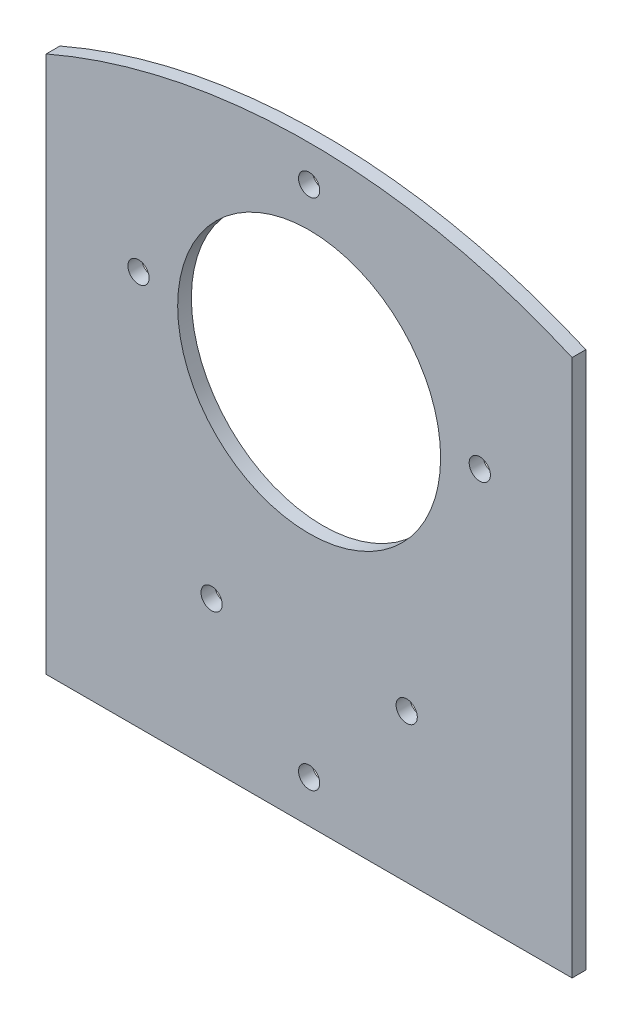
ISO-10303-21;
HEADER;
FILE_DESCRIPTION(('STEP AP214'),'2;1');
FILE_NAME('part.step','',(''),(''),'','','');
FILE_SCHEMA(('AUTOMOTIVE_DESIGN { 1 0 10303 214 1 1 1 1 }'));
ENDSEC;
DATA;
#1=APPLICATION_CONTEXT('core data for automotive mechanical design processes');
#2=APPLICATION_PROTOCOL_DEFINITION('international standard','automotive_design',2000,#1);
#3=PRODUCT_CONTEXT('',#1,'mechanical');
#4=PRODUCT('Part','Part','',(#3));
#5=PRODUCT_RELATED_PRODUCT_CATEGORY('part','',(#4));
#6=PRODUCT_DEFINITION_FORMATION('','',#4);
#7=PRODUCT_DEFINITION_CONTEXT('part definition',#1,'design');
#8=PRODUCT_DEFINITION('design','',#6,#7);
#9=PRODUCT_DEFINITION_SHAPE('','',#8);
#10=(LENGTH_UNIT() NAMED_UNIT(*) SI_UNIT(.MILLI.,.METRE.));
#11=(NAMED_UNIT(*) PLANE_ANGLE_UNIT() SI_UNIT($,.RADIAN.));
#12=(NAMED_UNIT(*) SI_UNIT($,.STERADIAN.) SOLID_ANGLE_UNIT());
#13=UNCERTAINTY_MEASURE_WITH_UNIT(LENGTH_MEASURE(1.E-05),#10,'distance_accuracy_value','');
#14=(GEOMETRIC_REPRESENTATION_CONTEXT(3) GLOBAL_UNCERTAINTY_ASSIGNED_CONTEXT((#13)) GLOBAL_UNIT_ASSIGNED_CONTEXT((#10,
#11,#12)) REPRESENTATION_CONTEXT('',''));
#15=CARTESIAN_POINT('',(0.,0.,0.));
#16=DIRECTION('',(0.,0.,1.));
#17=DIRECTION('',(1.,0.,0.));
#18=AXIS2_PLACEMENT_3D('',#15,#16,#17);
#19=CARTESIAN_POINT('',(-61.999999985,-87.3933536434245,2.771428571));
#20=DIRECTION('',(1.,0.,0.));
#21=DIRECTION('',(0.,0.,-1.));
#22=AXIS2_PLACEMENT_3D('',#19,#20,#21);
#23=PLANE('',#22);
#24=DIRECTION('',(0.,1.,0.));
#25=VECTOR('',#24,1.);
#26=CARTESIAN_POINT('',(-61.999999985,-87.3933536434245,-0.461428571));
#27=LINE('',#26,#25);
#28=CARTESIAN_POINT('',(-61.999999985,-48.8219250934247,-0.461428571));
#29=VERTEX_POINT('',#28);
#30=CARTESIAN_POINT('',(-61.999999985,77.869494806171,-0.461428571000001));
#31=VERTEX_POINT('',#30);
#32=EDGE_CURVE('E57',#29,#31,#27,.T.);
#33=ORIENTED_EDGE('',*,*,#32,.F.);
#34=DIRECTION('',(0.,0.,1.));
#35=VECTOR('',#34,1.);
#36=CARTESIAN_POINT('',(-61.999999985,-48.8219250934245,-7.228571429));
#37=LINE('',#36,#35);
#38=CARTESIAN_POINT('',(-61.999999985,-48.8219250934245,2.771428571));
#39=VERTEX_POINT('',#38);
#40=EDGE_CURVE('E50',#29,#39,#37,.T.);
#41=ORIENTED_EDGE('',*,*,#40,.T.);
#42=DIRECTION('',(0.,-1.,0.));
#43=VECTOR('',#42,1.);
#44=CARTESIAN_POINT('',(-61.999999985,-87.3933536434245,2.771428571));
#45=LINE('',#44,#43);
#46=CARTESIAN_POINT('',(-61.999999985,77.869494806171,2.771428571));
#47=VERTEX_POINT('',#46);
#48=EDGE_CURVE('E90',#47,#39,#45,.T.);
#49=ORIENTED_EDGE('',*,*,#48,.F.);
#50=DIRECTION('',(0.,0.,1.));
#51=VECTOR('',#50,1.);
#52=CARTESIAN_POINT('',(-61.999999985,77.869494806171,-14.942857139));
#53=LINE('',#52,#51);
#54=EDGE_CURVE('E102',#31,#47,#53,.T.);
#55=ORIENTED_EDGE('',*,*,#54,.F.);
#56=EDGE_LOOP('',(#33,#41,#49,#55));
#57=FACE_BOUND('',#56,.T.);
#58=ADVANCED_FACE('F37',(#57),#23,.F.);
#59=CARTESIAN_POINT('',(61.999999985,-87.3933536434244,2.771428571));
#60=DIRECTION('',(-1.,0.,0.));
#61=DIRECTION('',(0.,0.,1.));
#62=AXIS2_PLACEMENT_3D('',#59,#60,#61);
#63=PLANE('',#62);
#64=DIRECTION('',(0.,1.,0.));
#65=VECTOR('',#64,1.);
#66=CARTESIAN_POINT('',(61.999999985,-87.3933536434244,2.771428571));
#67=LINE('',#66,#65);
#68=CARTESIAN_POINT('',(61.999999985,-48.8219250934249,2.771428571));
#69=VERTEX_POINT('',#68);
#70=CARTESIAN_POINT('',(61.999999985,77.869494806171,2.771428571));
#71=VERTEX_POINT('',#70);
#72=EDGE_CURVE('E44',#69,#71,#67,.T.);
#73=ORIENTED_EDGE('',*,*,#72,.F.);
#74=DIRECTION('',(0.,0.,1.));
#75=VECTOR('',#74,1.);
#76=CARTESIAN_POINT('',(61.999999985,-48.8219250934249,-7.228571429));
#77=LINE('',#76,#75);
#78=CARTESIAN_POINT('',(61.999999985,-48.8219250934249,-0.461428571));
#79=VERTEX_POINT('',#78);
#80=EDGE_CURVE('E74',#79,#69,#77,.T.);
#81=ORIENTED_EDGE('',*,*,#80,.F.);
#82=DIRECTION('',(0.,-1.,0.));
#83=VECTOR('',#82,1.);
#84=CARTESIAN_POINT('',(61.999999985,77.869494806171,-0.461428571));
#85=LINE('',#84,#83);
#86=CARTESIAN_POINT('',(61.999999985,77.869494806171,-0.461428571));
#87=VERTEX_POINT('',#86);
#88=EDGE_CURVE('E107',#87,#79,#85,.T.);
#89=ORIENTED_EDGE('',*,*,#88,.F.);
#90=DIRECTION('',(0.,0.,1.));
#91=VECTOR('',#90,1.);
#92=CARTESIAN_POINT('',(61.999999985,77.869494806171,-14.942857139));
#93=LINE('',#92,#91);
#94=EDGE_CURVE('E95',#87,#71,#93,.T.);
#95=ORIENTED_EDGE('',*,*,#94,.T.);
#96=EDGE_LOOP('',(#73,#81,#89,#95));
#97=FACE_BOUND('',#96,.T.);
#98=ADVANCED_FACE('F93',(#97),#63,.F.);
#99=CARTESIAN_POINT('',(0.,41.9209320395755,4.542857142));
#100=DIRECTION('',(0.,0.,-1.));
#101=DIRECTION('',(-1.,0.,0.));
#102=AXIS2_PLACEMENT_3D('',#99,#100,#101);
#103=CYLINDRICAL_SURFACE('',#102,30.9999999925);
#104=CARTESIAN_POINT('',(0.,41.9209320395755,2.771428571));
#105=DIRECTION('',(0.,0.,1.));
#106=DIRECTION('',(1.,0.,0.));
#107=AXIS2_PLACEMENT_3D('',#104,#105,#106);
#108=CIRCLE('',#107,30.9999999925);
#109=CARTESIAN_POINT('',(30.9999999925,41.9209320395755,2.771428571));
#110=VERTEX_POINT('',#109);
#111=EDGE_CURVE('E97',#110,#110,#108,.T.);
#112=ORIENTED_EDGE('',*,*,#111,.T.);
#113=EDGE_LOOP('',(#112));
#114=FACE_BOUND('',#113,.T.);
#115=CARTESIAN_POINT('',(0.,41.9209320395755,-0.461428571));
#116=DIRECTION('',(0.,0.,-1.));
#117=DIRECTION('',(-1.,0.,0.));
#118=AXIS2_PLACEMENT_3D('',#115,#116,#117);
#119=CIRCLE('',#118,30.9999999925);
#120=CARTESIAN_POINT('',(-30.9999999925,41.9209320395755,-0.461428571));
#121=VERTEX_POINT('',#120);
#122=EDGE_CURVE('E112',#121,#121,#119,.T.);
#123=ORIENTED_EDGE('',*,*,#122,.T.);
#124=EDGE_LOOP('',(#123));
#125=FACE_BOUND('',#124,.T.);
#126=ADVANCED_FACE('F183',(#114,#125),#103,.F.);
#127=CARTESIAN_POINT('',(0.,-64.6590896481976,-14.942857139));
#128=DIRECTION('',(0.,0.,1.));
#129=DIRECTION('',(1.,0.,0.));
#130=AXIS2_PLACEMENT_3D('',#127,#128,#129);
#131=CYLINDRICAL_SURFACE('',#130,155.429718473354);
#132=CARTESIAN_POINT('',(0.,-64.6590896481976,-0.461428571));
#133=DIRECTION('',(0.,0.,-1.));
#134=DIRECTION('',(-1.,0.,0.));
#135=AXIS2_PLACEMENT_3D('',#132,#133,#134);
#136=CIRCLE('',#135,155.429718473354);
#137=EDGE_CURVE('E109',#31,#87,#136,.T.);
#138=ORIENTED_EDGE('',*,*,#137,.F.);
#139=ORIENTED_EDGE('',*,*,#54,.T.);
#140=CARTESIAN_POINT('',(0.,-64.6590896481976,2.771428571));
#141=DIRECTION('',(0.,0.,-1.));
#142=DIRECTION('',(-1.,0.,0.));
#143=AXIS2_PLACEMENT_3D('',#140,#141,#142);
#144=CIRCLE('',#143,155.429718473354);
#145=EDGE_CURVE('E104',#47,#71,#144,.T.);
#146=ORIENTED_EDGE('',*,*,#145,.T.);
#147=ORIENTED_EDGE('',*,*,#94,.F.);
#148=EDGE_LOOP('',(#138,#139,#146,#147));
#149=FACE_BOUND('',#148,.T.);
#150=ADVANCED_FACE('F158',(#149),#131,.T.);
#151=CARTESIAN_POINT('',(0.,5.60664633407555,2.771428571));
#152=DIRECTION('',(0.,0.,1.));
#153=DIRECTION('',(1.,0.,0.));
#154=AXIS2_PLACEMENT_3D('',#151,#152,#153);
#155=PLANE('',#154);
#156=CARTESIAN_POINT('',(-40.2334024909349,44.2368171840592,2.771428571));
#157=DIRECTION('',(0.,0.,1.));
#158=DIRECTION('',(1.,0.,0.));
#159=AXIS2_PLACEMENT_3D('',#156,#157,#158);
#160=CIRCLE('',#159,2.5);
#161=CARTESIAN_POINT('',(-37.7334024909349,44.2368171840592,2.771428571));
#162=VERTEX_POINT('',#161);
#163=EDGE_CURVE('E144',#162,#162,#160,.T.);
#164=ORIENTED_EDGE('',*,*,#163,.F.);
#165=EDGE_LOOP('',(#164));
#166=FACE_BOUND('',#165,.T.);
#167=CARTESIAN_POINT('',(0.,82.2209320395757,2.771428571));
#168=DIRECTION('',(0.,0.,1.));
#169=DIRECTION('',(1.,0.,0.));
#170=AXIS2_PLACEMENT_3D('',#167,#168,#169);
#171=CIRCLE('',#170,2.5);
#172=CARTESIAN_POINT('',(2.49999999999995,82.2209320395757,2.771428571));
#173=VERTEX_POINT('',#172);
#174=EDGE_CURVE('E137',#173,#173,#171,.T.);
#175=ORIENTED_EDGE('',*,*,#174,.F.);
#176=EDGE_LOOP('',(#175));
#177=FACE_BOUND('',#176,.T.);
#178=CARTESIAN_POINT('',(40.2334007714421,44.2368470562634,2.771428571));
#179=DIRECTION('',(0.,0.,1.));
#180=DIRECTION('',(1.,0.,0.));
#181=AXIS2_PLACEMENT_3D('',#178,#179,#180);
#182=CIRCLE('',#181,2.5);
#183=CARTESIAN_POINT('',(42.7334007714421,44.2368470562634,2.771428571));
#184=VERTEX_POINT('',#183);
#185=EDGE_CURVE('E138',#184,#184,#182,.T.);
#186=ORIENTED_EDGE('',*,*,#185,.F.);
#187=EDGE_LOOP('',(#186));
#188=FACE_BOUND('',#187,.T.);
#189=CARTESIAN_POINT('',(0.,-38.8219250934245,2.771428571));
#190=DIRECTION('',(0.,0.,1.));
#191=DIRECTION('',(1.,0.,0.));
#192=AXIS2_PLACEMENT_3D('',#189,#190,#191);
#193=CIRCLE('',#192,2.5);
#194=CARTESIAN_POINT('',(2.50000000000001,-38.8219250934245,2.771428571));
#195=VERTEX_POINT('',#194);
#196=EDGE_CURVE('E127',#195,#195,#193,.T.);
#197=ORIENTED_EDGE('',*,*,#196,.F.);
#198=EDGE_LOOP('',(#197));
#199=FACE_BOUND('',#198,.T.);
#200=CARTESIAN_POINT('',(-23.,-13.8219250934245,2.771428571));
#201=DIRECTION('',(0.,0.,1.));
#202=DIRECTION('',(1.,0.,0.));
#203=AXIS2_PLACEMENT_3D('',#200,#201,#202);
#204=CIRCLE('',#203,2.5);
#205=CARTESIAN_POINT('',(-20.5,-13.8219250934245,2.771428571));
#206=VERTEX_POINT('',#205);
#207=EDGE_CURVE('E119',#206,#206,#204,.T.);
#208=ORIENTED_EDGE('',*,*,#207,.F.);
#209=EDGE_LOOP('',(#208));
#210=FACE_BOUND('',#209,.T.);
#211=CARTESIAN_POINT('',(23.,-13.8219250934245,2.771428571));
#212=DIRECTION('',(0.,0.,1.));
#213=DIRECTION('',(-1.,0.,0.));
#214=AXIS2_PLACEMENT_3D('',#211,#212,#213);
#215=CIRCLE('',#214,2.5);
#216=CARTESIAN_POINT('',(20.5,-13.8219250934245,2.771428571));
#217=VERTEX_POINT('',#216);
#218=EDGE_CURVE('E120',#217,#217,#215,.T.);
#219=ORIENTED_EDGE('',*,*,#218,.F.);
#220=EDGE_LOOP('',(#219));
#221=FACE_BOUND('',#220,.T.);
#222=DIRECTION('',(-1.,0.,0.));
#223=VECTOR('',#222,1.);
#224=CARTESIAN_POINT('',(61.999999985,-48.8219250934249,2.771428571));
#225=LINE('',#224,#223);
#226=EDGE_CURVE('E77',#69,#39,#225,.T.);
#227=ORIENTED_EDGE('',*,*,#226,.F.);
#228=ORIENTED_EDGE('',*,*,#72,.T.);
#229=ORIENTED_EDGE('',*,*,#145,.F.);
#230=ORIENTED_EDGE('',*,*,#48,.T.);
#231=EDGE_LOOP('',(#227,#228,#229,#230));
#232=FACE_BOUND('',#231,.T.);
#233=ORIENTED_EDGE('',*,*,#111,.F.);
#234=EDGE_LOOP('',(#233));
#235=FACE_BOUND('',#234,.T.);
#236=ADVANCED_FACE('F85',(#166,#177,#188,#199,#210,#221,#232,#235),#155,.T.);
#237=CARTESIAN_POINT('',(0.,-64.6590896481976,-0.461428571));
#238=DIRECTION('',(0.,0.,-1.));
#239=DIRECTION('',(-1.,0.,0.));
#240=AXIS2_PLACEMENT_3D('',#237,#238,#239);
#241=PLANE('',#240);
#242=CARTESIAN_POINT('',(-40.2334024909349,44.2368171840592,-0.461428571));
#243=DIRECTION('',(0.,0.,-1.));
#244=DIRECTION('',(-1.,0.,0.));
#245=AXIS2_PLACEMENT_3D('',#242,#243,#244);
#246=CIRCLE('',#245,2.5);
#247=CARTESIAN_POINT('',(-42.7334024909349,44.2368171840592,-0.461428571));
#248=VERTEX_POINT('',#247);
#249=EDGE_CURVE('E123',#248,#248,#246,.F.);
#250=ORIENTED_EDGE('',*,*,#249,.T.);
#251=EDGE_LOOP('',(#250));
#252=FACE_BOUND('',#251,.T.);
#253=CARTESIAN_POINT('',(0.,82.2209320395757,-0.461428571));
#254=DIRECTION('',(0.,0.,-1.));
#255=DIRECTION('',(-1.,0.,0.));
#256=AXIS2_PLACEMENT_3D('',#253,#254,#255);
#257=CIRCLE('',#256,2.5);
#258=CARTESIAN_POINT('',(-2.50000000000006,82.2209320395757,-0.461428571));
#259=VERTEX_POINT('',#258);
#260=EDGE_CURVE('E141',#259,#259,#257,.F.);
#261=ORIENTED_EDGE('',*,*,#260,.T.);
#262=EDGE_LOOP('',(#261));
#263=FACE_BOUND('',#262,.T.);
#264=CARTESIAN_POINT('',(40.2334007714421,44.2368470562634,-0.461428571));
#265=DIRECTION('',(0.,0.,-1.));
#266=DIRECTION('',(-1.,0.,0.));
#267=AXIS2_PLACEMENT_3D('',#264,#265,#266);
#268=CIRCLE('',#267,2.5);
#269=CARTESIAN_POINT('',(37.7334007714421,44.2368470562634,-0.461428571));
#270=VERTEX_POINT('',#269);
#271=EDGE_CURVE('E134',#270,#270,#268,.F.);
#272=ORIENTED_EDGE('',*,*,#271,.T.);
#273=EDGE_LOOP('',(#272));
#274=FACE_BOUND('',#273,.T.);
#275=CARTESIAN_POINT('',(0.,-38.8219250934245,-0.461428571));
#276=DIRECTION('',(0.,0.,-1.));
#277=DIRECTION('',(-1.,0.,0.));
#278=AXIS2_PLACEMENT_3D('',#275,#276,#277);
#279=CIRCLE('',#278,2.5);
#280=CARTESIAN_POINT('',(-2.49999999999999,-38.8219250934245,-0.461428571));
#281=VERTEX_POINT('',#280);
#282=EDGE_CURVE('E91',#281,#281,#279,.F.);
#283=ORIENTED_EDGE('',*,*,#282,.T.);
#284=EDGE_LOOP('',(#283));
#285=FACE_BOUND('',#284,.T.);
#286=CARTESIAN_POINT('',(-23.,-13.8219250934245,-0.461428571));
#287=DIRECTION('',(0.,0.,-1.));
#288=DIRECTION('',(-1.,0.,0.));
#289=AXIS2_PLACEMENT_3D('',#286,#287,#288);
#290=CIRCLE('',#289,2.5);
#291=CARTESIAN_POINT('',(-25.5,-13.8219250934245,-0.461428571));
#292=VERTEX_POINT('',#291);
#293=EDGE_CURVE('E124',#292,#292,#290,.F.);
#294=ORIENTED_EDGE('',*,*,#293,.T.);
#295=EDGE_LOOP('',(#294));
#296=FACE_BOUND('',#295,.T.);
#297=CARTESIAN_POINT('',(23.,-13.8219250934245,-0.461428571));
#298=DIRECTION('',(0.,0.,-1.));
#299=DIRECTION('',(-1.,0.,0.));
#300=AXIS2_PLACEMENT_3D('',#297,#298,#299);
#301=CIRCLE('',#300,2.5);
#302=CARTESIAN_POINT('',(20.5,-13.8219250934245,-0.461428571));
#303=VERTEX_POINT('',#302);
#304=EDGE_CURVE('E116',#303,#303,#301,.F.);
#305=ORIENTED_EDGE('',*,*,#304,.T.);
#306=EDGE_LOOP('',(#305));
#307=FACE_BOUND('',#306,.T.);
#308=DIRECTION('',(1.,0.,0.));
#309=VECTOR('',#308,1.);
#310=CARTESIAN_POINT('',(0.,-48.8219250934247,-0.461428571));
#311=LINE('',#310,#309);
#312=EDGE_CURVE('E11',#29,#79,#311,.T.);
#313=ORIENTED_EDGE('',*,*,#312,.F.);
#314=ORIENTED_EDGE('',*,*,#32,.T.);
#315=ORIENTED_EDGE('',*,*,#137,.T.);
#316=ORIENTED_EDGE('',*,*,#88,.T.);
#317=EDGE_LOOP('',(#313,#314,#315,#316));
#318=FACE_BOUND('',#317,.T.);
#319=ORIENTED_EDGE('',*,*,#122,.F.);
#320=EDGE_LOOP('',(#319));
#321=FACE_BOUND('',#320,.T.);
#322=ADVANCED_FACE('F157',(#252,#263,#274,#285,#296,#307,#318,#321),#241,.T.);
#323=CARTESIAN_POINT('',(61.999999985,-48.8219250934249,-7.228571429));
#324=DIRECTION('',(0.,1.,0.));
#325=DIRECTION('',(-1.,0.,0.));
#326=AXIS2_PLACEMENT_3D('',#323,#324,#325);
#327=PLANE('',#326);
#328=ORIENTED_EDGE('',*,*,#312,.T.);
#329=ORIENTED_EDGE('',*,*,#80,.T.);
#330=ORIENTED_EDGE('',*,*,#226,.T.);
#331=ORIENTED_EDGE('',*,*,#40,.F.);
#332=EDGE_LOOP('',(#328,#329,#330,#331));
#333=FACE_BOUND('',#332,.T.);
#334=ADVANCED_FACE('F76',(#333),#327,.F.);
#335=CARTESIAN_POINT('',(23.,-13.8219250934245,-7.53249638286548));
#336=DIRECTION('',(0.,0.,1.));
#337=DIRECTION('',(1.,0.,0.));
#338=AXIS2_PLACEMENT_3D('',#335,#336,#337);
#339=CYLINDRICAL_SURFACE('',#338,2.5);
#340=ORIENTED_EDGE('',*,*,#218,.T.);
#341=EDGE_LOOP('',(#340));
#342=FACE_BOUND('',#341,.T.);
#343=ORIENTED_EDGE('',*,*,#304,.F.);
#344=EDGE_LOOP('',(#343));
#345=FACE_BOUND('',#344,.T.);
#346=ADVANCED_FACE('F170',(#342,#345),#339,.F.);
#347=CARTESIAN_POINT('',(-23.,-13.8219250934245,-7.53249638286548));
#348=DIRECTION('',(0.,0.,1.));
#349=DIRECTION('',(1.,0.,0.));
#350=AXIS2_PLACEMENT_3D('',#347,#348,#349);
#351=CYLINDRICAL_SURFACE('',#350,2.5);
#352=ORIENTED_EDGE('',*,*,#207,.T.);
#353=EDGE_LOOP('',(#352));
#354=FACE_BOUND('',#353,.T.);
#355=ORIENTED_EDGE('',*,*,#293,.F.);
#356=EDGE_LOOP('',(#355));
#357=FACE_BOUND('',#356,.T.);
#358=ADVANCED_FACE('F173',(#354,#357),#351,.F.);
#359=CARTESIAN_POINT('',(0.,-38.8219250934245,-7.53249638286548));
#360=DIRECTION('',(0.,0.,1.));
#361=DIRECTION('',(1.,0.,0.));
#362=AXIS2_PLACEMENT_3D('',#359,#360,#361);
#363=CYLINDRICAL_SURFACE('',#362,2.5);
#364=ORIENTED_EDGE('',*,*,#196,.T.);
#365=EDGE_LOOP('',(#364));
#366=FACE_BOUND('',#365,.T.);
#367=ORIENTED_EDGE('',*,*,#282,.F.);
#368=EDGE_LOOP('',(#367));
#369=FACE_BOUND('',#368,.T.);
#370=ADVANCED_FACE('F228',(#366,#369),#363,.F.);
#371=CARTESIAN_POINT('',(40.2334007714421,44.2368470562634,-7.53249638286548));
#372=DIRECTION('',(0.,0.,1.));
#373=DIRECTION('',(1.,0.,0.));
#374=AXIS2_PLACEMENT_3D('',#371,#372,#373);
#375=CYLINDRICAL_SURFACE('',#374,2.5);
#376=ORIENTED_EDGE('',*,*,#185,.T.);
#377=EDGE_LOOP('',(#376));
#378=FACE_BOUND('',#377,.T.);
#379=ORIENTED_EDGE('',*,*,#271,.F.);
#380=EDGE_LOOP('',(#379));
#381=FACE_BOUND('',#380,.T.);
#382=ADVANCED_FACE('F238',(#378,#381),#375,.F.);
#383=CARTESIAN_POINT('',(0.,82.2209320395757,-7.53249638286548));
#384=DIRECTION('',(0.,0.,1.));
#385=DIRECTION('',(1.,0.,0.));
#386=AXIS2_PLACEMENT_3D('',#383,#384,#385);
#387=CYLINDRICAL_SURFACE('',#386,2.5);
#388=ORIENTED_EDGE('',*,*,#174,.T.);
#389=EDGE_LOOP('',(#388));
#390=FACE_BOUND('',#389,.T.);
#391=ORIENTED_EDGE('',*,*,#260,.F.);
#392=EDGE_LOOP('',(#391));
#393=FACE_BOUND('',#392,.T.);
#394=ADVANCED_FACE('F260',(#390,#393),#387,.F.);
#395=CARTESIAN_POINT('',(-40.2334024909349,44.2368171840592,-7.53249638286548));
#396=DIRECTION('',(0.,0.,1.));
#397=DIRECTION('',(1.,0.,0.));
#398=AXIS2_PLACEMENT_3D('',#395,#396,#397);
#399=CYLINDRICAL_SURFACE('',#398,2.5);
#400=ORIENTED_EDGE('',*,*,#163,.T.);
#401=EDGE_LOOP('',(#400));
#402=FACE_BOUND('',#401,.T.);
#403=ORIENTED_EDGE('',*,*,#249,.F.);
#404=EDGE_LOOP('',(#403));
#405=FACE_BOUND('',#404,.T.);
#406=ADVANCED_FACE('F152',(#402,#405),#399,.F.);
#407=CLOSED_SHELL('',(#58,#98,#126,#150,#236,#322,#334,#346,#358,#370,#382,#394,#406));
#408=MANIFOLD_SOLID_BREP('B2',#407);
#409=ADVANCED_BREP_SHAPE_REPRESENTATION('',(#18,#408),#14);
#410=SHAPE_DEFINITION_REPRESENTATION(#9,#409);
ENDSEC;
END-ISO-10303-21;
